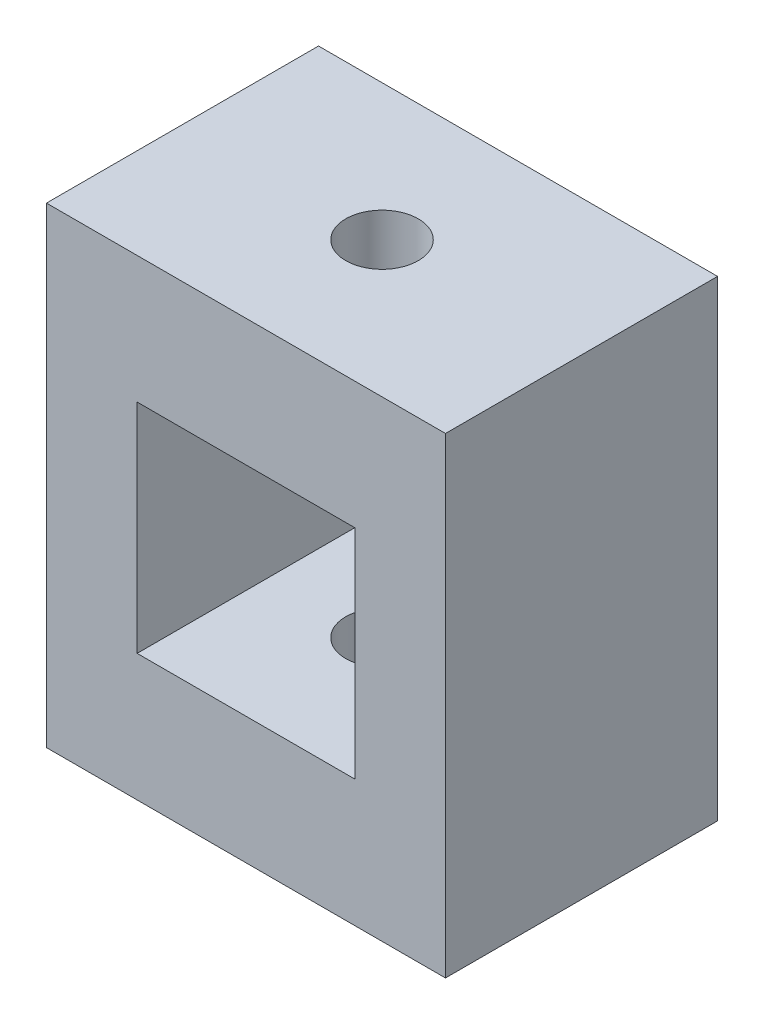
ISO-10303-21;
HEADER;
FILE_DESCRIPTION(('STEP AP214'),'2;1');
FILE_NAME('part.step','',(''),(''),'','','');
FILE_SCHEMA(('AUTOMOTIVE_DESIGN { 1 0 10303 214 1 1 1 1 }'));
ENDSEC;
DATA;
#1=APPLICATION_CONTEXT('core data for automotive mechanical design processes');
#2=APPLICATION_PROTOCOL_DEFINITION('international standard','automotive_design',2000,#1);
#3=PRODUCT_CONTEXT('',#1,'mechanical');
#4=PRODUCT('Part','Part','',(#3));
#5=PRODUCT_RELATED_PRODUCT_CATEGORY('part','',(#4));
#6=PRODUCT_DEFINITION_FORMATION('','',#4);
#7=PRODUCT_DEFINITION_CONTEXT('part definition',#1,'design');
#8=PRODUCT_DEFINITION('design','',#6,#7);
#9=PRODUCT_DEFINITION_SHAPE('','',#8);
#10=(LENGTH_UNIT() NAMED_UNIT(*) SI_UNIT(.MILLI.,.METRE.));
#11=(NAMED_UNIT(*) PLANE_ANGLE_UNIT() SI_UNIT($,.RADIAN.));
#12=(NAMED_UNIT(*) SI_UNIT($,.STERADIAN.) SOLID_ANGLE_UNIT());
#13=UNCERTAINTY_MEASURE_WITH_UNIT(LENGTH_MEASURE(1.E-05),#10,'distance_accuracy_value','');
#14=(GEOMETRIC_REPRESENTATION_CONTEXT(3) GLOBAL_UNCERTAINTY_ASSIGNED_CONTEXT((#13)) GLOBAL_UNIT_ASSIGNED_CONTEXT((#10,
#11,#12)) REPRESENTATION_CONTEXT('',''));
#15=CARTESIAN_POINT('',(0.,0.,0.));
#16=DIRECTION('',(0.,0.,1.));
#17=DIRECTION('',(1.,0.,0.));
#18=AXIS2_PLACEMENT_3D('',#15,#16,#17);
#19=CARTESIAN_POINT('',(0.,0.,15.));
#20=DIRECTION('',(0.,0.,-1.));
#21=DIRECTION('',(-1.,0.,0.));
#22=AXIS2_PLACEMENT_3D('',#19,#20,#21);
#23=PLANE('',#22);
#24=DIRECTION('',(0.,-1.,0.));
#25=VECTOR('',#24,1.);
#26=CARTESIAN_POINT('',(0.,0.,15.));
#27=LINE('',#26,#25);
#28=CARTESIAN_POINT('',(0.,26.,15.));
#29=VERTEX_POINT('',#28);
#30=CARTESIAN_POINT('',(0.,0.,15.));
#31=VERTEX_POINT('',#30);
#32=EDGE_CURVE('E162',#29,#31,#27,.T.);
#33=ORIENTED_EDGE('',*,*,#32,.T.);
#34=DIRECTION('',(1.,0.,0.));
#35=VECTOR('',#34,1.);
#36=CARTESIAN_POINT('',(0.,0.,15.));
#37=LINE('',#36,#35);
#38=CARTESIAN_POINT('',(22.,0.,15.));
#39=VERTEX_POINT('',#38);
#40=EDGE_CURVE('E166',#31,#39,#37,.T.);
#41=ORIENTED_EDGE('',*,*,#40,.T.);
#42=DIRECTION('',(0.,1.,0.));
#43=VECTOR('',#42,1.);
#44=CARTESIAN_POINT('',(22.,0.,15.));
#45=LINE('',#44,#43);
#46=CARTESIAN_POINT('',(22.,26.,15.));
#47=VERTEX_POINT('',#46);
#48=EDGE_CURVE('E170',#39,#47,#45,.T.);
#49=ORIENTED_EDGE('',*,*,#48,.T.);
#50=DIRECTION('',(-1.,0.,0.));
#51=VECTOR('',#50,1.);
#52=CARTESIAN_POINT('',(0.,26.,15.));
#53=LINE('',#52,#51);
#54=EDGE_CURVE('E173',#47,#29,#53,.T.);
#55=ORIENTED_EDGE('',*,*,#54,.T.);
#56=EDGE_LOOP('',(#33,#41,#49,#55));
#57=FACE_BOUND('',#56,.T.);
#58=DIRECTION('',(0.,-1.,0.));
#59=VECTOR('',#58,1.);
#60=CARTESIAN_POINT('',(4.99999999999999,7.,15.));
#61=LINE('',#60,#59);
#62=CARTESIAN_POINT('',(4.99999999999999,19.,15.));
#63=VERTEX_POINT('',#62);
#64=CARTESIAN_POINT('',(4.99999999999999,7.,15.));
#65=VERTEX_POINT('',#64);
#66=EDGE_CURVE('E112',#63,#65,#61,.T.);
#67=ORIENTED_EDGE('',*,*,#66,.F.);
#68=DIRECTION('',(-1.,0.,0.));
#69=VECTOR('',#68,1.);
#70=CARTESIAN_POINT('',(4.99999999999999,19.,15.));
#71=LINE('',#70,#69);
#72=CARTESIAN_POINT('',(17.,19.,15.));
#73=VERTEX_POINT('',#72);
#74=EDGE_CURVE('E138',#73,#63,#71,.T.);
#75=ORIENTED_EDGE('',*,*,#74,.F.);
#76=DIRECTION('',(0.,1.,0.));
#77=VECTOR('',#76,1.);
#78=CARTESIAN_POINT('',(17.,7.,15.));
#79=LINE('',#78,#77);
#80=CARTESIAN_POINT('',(17.,7.,15.));
#81=VERTEX_POINT('',#80);
#82=EDGE_CURVE('E134',#81,#73,#79,.T.);
#83=ORIENTED_EDGE('',*,*,#82,.F.);
#84=DIRECTION('',(1.,0.,0.));
#85=VECTOR('',#84,1.);
#86=CARTESIAN_POINT('',(4.99999999999999,7.,15.));
#87=LINE('',#86,#85);
#88=EDGE_CURVE('E121',#65,#81,#87,.T.);
#89=ORIENTED_EDGE('',*,*,#88,.F.);
#90=EDGE_LOOP('',(#67,#75,#83,#89));
#91=FACE_BOUND('',#90,.T.);
#92=ADVANCED_FACE('F45',(#57,#91),#23,.F.);
#93=CARTESIAN_POINT('',(0.,0.,0.));
#94=DIRECTION('',(0.,0.,-1.));
#95=DIRECTION('',(-1.,0.,0.));
#96=AXIS2_PLACEMENT_3D('',#93,#94,#95);
#97=PLANE('',#96);
#98=DIRECTION('',(0.,-1.,0.));
#99=VECTOR('',#98,1.);
#100=CARTESIAN_POINT('',(0.,0.,0.));
#101=LINE('',#100,#99);
#102=CARTESIAN_POINT('',(0.,26.,0.));
#103=VERTEX_POINT('',#102);
#104=CARTESIAN_POINT('',(0.,0.,0.));
#105=VERTEX_POINT('',#104);
#106=EDGE_CURVE('E130',#103,#105,#101,.T.);
#107=ORIENTED_EDGE('',*,*,#106,.F.);
#108=DIRECTION('',(-1.,0.,0.));
#109=VECTOR('',#108,1.);
#110=CARTESIAN_POINT('',(0.,26.,0.));
#111=LINE('',#110,#109);
#112=CARTESIAN_POINT('',(22.,26.,0.));
#113=VERTEX_POINT('',#112);
#114=EDGE_CURVE('E167',#113,#103,#111,.T.);
#115=ORIENTED_EDGE('',*,*,#114,.F.);
#116=DIRECTION('',(0.,1.,0.));
#117=VECTOR('',#116,1.);
#118=CARTESIAN_POINT('',(22.,0.,0.));
#119=LINE('',#118,#117);
#120=CARTESIAN_POINT('',(22.,0.,0.));
#121=VERTEX_POINT('',#120);
#122=EDGE_CURVE('E183',#121,#113,#119,.T.);
#123=ORIENTED_EDGE('',*,*,#122,.F.);
#124=DIRECTION('',(1.,0.,0.));
#125=VECTOR('',#124,1.);
#126=CARTESIAN_POINT('',(0.,0.,0.));
#127=LINE('',#126,#125);
#128=EDGE_CURVE('E180',#105,#121,#127,.T.);
#129=ORIENTED_EDGE('',*,*,#128,.F.);
#130=EDGE_LOOP('',(#107,#115,#123,#129));
#131=FACE_BOUND('',#130,.T.);
#132=DIRECTION('',(-1.,0.,0.));
#133=VECTOR('',#132,1.);
#134=CARTESIAN_POINT('',(4.99999999999999,19.,0.));
#135=LINE('',#134,#133);
#136=CARTESIAN_POINT('',(17.,19.,0.));
#137=VERTEX_POINT('',#136);
#138=CARTESIAN_POINT('',(4.99999999999999,19.,0.));
#139=VERTEX_POINT('',#138);
#140=EDGE_CURVE('E122',#137,#139,#135,.T.);
#141=ORIENTED_EDGE('',*,*,#140,.T.);
#142=DIRECTION('',(0.,-1.,0.));
#143=VECTOR('',#142,1.);
#144=CARTESIAN_POINT('',(4.99999999999999,7.,0.));
#145=LINE('',#144,#143);
#146=CARTESIAN_POINT('',(4.99999999999999,7.,0.));
#147=VERTEX_POINT('',#146);
#148=EDGE_CURVE('E70',#139,#147,#145,.T.);
#149=ORIENTED_EDGE('',*,*,#148,.T.);
#150=DIRECTION('',(1.,0.,0.));
#151=VECTOR('',#150,1.);
#152=CARTESIAN_POINT('',(4.99999999999999,7.,0.));
#153=LINE('',#152,#151);
#154=CARTESIAN_POINT('',(17.,7.,0.));
#155=VERTEX_POINT('',#154);
#156=EDGE_CURVE('E128',#147,#155,#153,.T.);
#157=ORIENTED_EDGE('',*,*,#156,.T.);
#158=DIRECTION('',(0.,1.,0.));
#159=VECTOR('',#158,1.);
#160=CARTESIAN_POINT('',(17.,7.,0.));
#161=LINE('',#160,#159);
#162=EDGE_CURVE('E149',#155,#137,#161,.T.);
#163=ORIENTED_EDGE('',*,*,#162,.T.);
#164=EDGE_LOOP('',(#141,#149,#157,#163));
#165=FACE_BOUND('',#164,.T.);
#166=ADVANCED_FACE('F207',(#131,#165),#97,.T.);
#167=CARTESIAN_POINT('',(0.,0.,15.));
#168=DIRECTION('',(1.,0.,0.));
#169=DIRECTION('',(0.,0.,-1.));
#170=AXIS2_PLACEMENT_3D('',#167,#168,#169);
#171=PLANE('',#170);
#172=ORIENTED_EDGE('',*,*,#106,.T.);
#173=DIRECTION('',(0.,0.,-1.));
#174=VECTOR('',#173,1.);
#175=CARTESIAN_POINT('',(0.,0.,15.));
#176=LINE('',#175,#174);
#177=EDGE_CURVE('E11',#31,#105,#176,.T.);
#178=ORIENTED_EDGE('',*,*,#177,.F.);
#179=ORIENTED_EDGE('',*,*,#32,.F.);
#180=DIRECTION('',(0.,0.,-1.));
#181=VECTOR('',#180,1.);
#182=CARTESIAN_POINT('',(0.,26.,15.));
#183=LINE('',#182,#181);
#184=EDGE_CURVE('E176',#29,#103,#183,.T.);
#185=ORIENTED_EDGE('',*,*,#184,.T.);
#186=EDGE_LOOP('',(#172,#178,#179,#185));
#187=FACE_BOUND('',#186,.T.);
#188=ADVANCED_FACE('F47',(#187),#171,.F.);
#189=CARTESIAN_POINT('',(0.,0.,15.));
#190=DIRECTION('',(0.,1.,0.));
#191=DIRECTION('',(0.,0.,1.));
#192=AXIS2_PLACEMENT_3D('',#189,#190,#191);
#193=PLANE('',#192);
#194=CARTESIAN_POINT('',(11.,0.,7.5));
#195=DIRECTION('',(0.,1.,0.));
#196=DIRECTION('',(0.,0.,1.));
#197=AXIS2_PLACEMENT_3D('',#194,#195,#196);
#198=CIRCLE('',#197,2.);
#199=CARTESIAN_POINT('',(11.,0.,9.5));
#200=VERTEX_POINT('',#199);
#201=EDGE_CURVE('E146',#200,#200,#198,.T.);
#202=ORIENTED_EDGE('',*,*,#201,.T.);
#203=EDGE_LOOP('',(#202));
#204=FACE_BOUND('',#203,.T.);
#205=ORIENTED_EDGE('',*,*,#128,.T.);
#206=DIRECTION('',(0.,0.,-1.));
#207=VECTOR('',#206,1.);
#208=CARTESIAN_POINT('',(22.,0.,15.));
#209=LINE('',#208,#207);
#210=EDGE_CURVE('E55',#39,#121,#209,.T.);
#211=ORIENTED_EDGE('',*,*,#210,.F.);
#212=ORIENTED_EDGE('',*,*,#40,.F.);
#213=ORIENTED_EDGE('',*,*,#177,.T.);
#214=EDGE_LOOP('',(#205,#211,#212,#213));
#215=FACE_BOUND('',#214,.T.);
#216=ADVANCED_FACE('F217',(#204,#215),#193,.F.);
#217=CARTESIAN_POINT('',(22.,0.,15.));
#218=DIRECTION('',(-1.,0.,0.));
#219=DIRECTION('',(0.,0.,1.));
#220=AXIS2_PLACEMENT_3D('',#217,#218,#219);
#221=PLANE('',#220);
#222=ORIENTED_EDGE('',*,*,#122,.T.);
#223=DIRECTION('',(0.,0.,-1.));
#224=VECTOR('',#223,1.);
#225=CARTESIAN_POINT('',(22.,26.,15.));
#226=LINE('',#225,#224);
#227=EDGE_CURVE('E191',#47,#113,#226,.T.);
#228=ORIENTED_EDGE('',*,*,#227,.F.);
#229=ORIENTED_EDGE('',*,*,#48,.F.);
#230=ORIENTED_EDGE('',*,*,#210,.T.);
#231=EDGE_LOOP('',(#222,#228,#229,#230));
#232=FACE_BOUND('',#231,.T.);
#233=ADVANCED_FACE('F201',(#232),#221,.F.);
#234=CARTESIAN_POINT('',(0.,26.,15.));
#235=DIRECTION('',(0.,-1.,0.));
#236=DIRECTION('',(0.,0.,-1.));
#237=AXIS2_PLACEMENT_3D('',#234,#235,#236);
#238=PLANE('',#237);
#239=CARTESIAN_POINT('',(11.,26.,7.5));
#240=DIRECTION('',(0.,1.,0.));
#241=DIRECTION('',(0.,0.,1.));
#242=AXIS2_PLACEMENT_3D('',#239,#240,#241);
#243=CIRCLE('',#242,2.);
#244=CARTESIAN_POINT('',(11.,26.,9.5));
#245=VERTEX_POINT('',#244);
#246=EDGE_CURVE('E244',#245,#245,#243,.T.);
#247=ORIENTED_EDGE('',*,*,#246,.F.);
#248=EDGE_LOOP('',(#247));
#249=FACE_BOUND('',#248,.T.);
#250=ORIENTED_EDGE('',*,*,#114,.T.);
#251=ORIENTED_EDGE('',*,*,#184,.F.);
#252=ORIENTED_EDGE('',*,*,#54,.F.);
#253=ORIENTED_EDGE('',*,*,#227,.T.);
#254=EDGE_LOOP('',(#250,#251,#252,#253));
#255=FACE_BOUND('',#254,.T.);
#256=ADVANCED_FACE('F211',(#249,#255),#238,.F.);
#257=CARTESIAN_POINT('',(4.99999999999999,7.,15.));
#258=DIRECTION('',(1.,0.,0.));
#259=DIRECTION('',(0.,0.,-1.));
#260=AXIS2_PLACEMENT_3D('',#257,#258,#259);
#261=PLANE('',#260);
#262=ORIENTED_EDGE('',*,*,#148,.F.);
#263=DIRECTION('',(0.,0.,-1.));
#264=VECTOR('',#263,1.);
#265=CARTESIAN_POINT('',(4.99999999999999,19.,15.));
#266=LINE('',#265,#264);
#267=EDGE_CURVE('E116',#63,#139,#266,.T.);
#268=ORIENTED_EDGE('',*,*,#267,.F.);
#269=ORIENTED_EDGE('',*,*,#66,.T.);
#270=DIRECTION('',(0.,0.,-1.));
#271=VECTOR('',#270,1.);
#272=CARTESIAN_POINT('',(4.99999999999999,7.,15.));
#273=LINE('',#272,#271);
#274=EDGE_CURVE('E115',#65,#147,#273,.T.);
#275=ORIENTED_EDGE('',*,*,#274,.T.);
#276=EDGE_LOOP('',(#262,#268,#269,#275));
#277=FACE_BOUND('',#276,.T.);
#278=ADVANCED_FACE('F114',(#277),#261,.T.);
#279=CARTESIAN_POINT('',(4.99999999999999,7.,15.));
#280=DIRECTION('',(0.,1.,0.));
#281=DIRECTION('',(-1.,0.,0.));
#282=AXIS2_PLACEMENT_3D('',#279,#280,#281);
#283=PLANE('',#282);
#284=CARTESIAN_POINT('',(11.,7.,7.5));
#285=DIRECTION('',(0.,1.,0.));
#286=DIRECTION('',(-1.,0.,0.));
#287=AXIS2_PLACEMENT_3D('',#284,#285,#286);
#288=CIRCLE('',#287,2.);
#289=CARTESIAN_POINT('',(9.,7.,7.5));
#290=VERTEX_POINT('',#289);
#291=EDGE_CURVE('E250',#290,#290,#288,.T.);
#292=ORIENTED_EDGE('',*,*,#291,.F.);
#293=EDGE_LOOP('',(#292));
#294=FACE_BOUND('',#293,.T.);
#295=ORIENTED_EDGE('',*,*,#156,.F.);
#296=ORIENTED_EDGE('',*,*,#274,.F.);
#297=ORIENTED_EDGE('',*,*,#88,.T.);
#298=DIRECTION('',(0.,0.,-1.));
#299=VECTOR('',#298,1.);
#300=CARTESIAN_POINT('',(17.,7.,15.));
#301=LINE('',#300,#299);
#302=EDGE_CURVE('E131',#81,#155,#301,.T.);
#303=ORIENTED_EDGE('',*,*,#302,.T.);
#304=EDGE_LOOP('',(#295,#296,#297,#303));
#305=FACE_BOUND('',#304,.T.);
#306=ADVANCED_FACE('F125',(#294,#305),#283,.T.);
#307=CARTESIAN_POINT('',(17.,7.,15.));
#308=DIRECTION('',(-1.,0.,0.));
#309=DIRECTION('',(0.,0.,1.));
#310=AXIS2_PLACEMENT_3D('',#307,#308,#309);
#311=PLANE('',#310);
#312=ORIENTED_EDGE('',*,*,#162,.F.);
#313=ORIENTED_EDGE('',*,*,#302,.F.);
#314=ORIENTED_EDGE('',*,*,#82,.T.);
#315=DIRECTION('',(0.,0.,-1.));
#316=VECTOR('',#315,1.);
#317=CARTESIAN_POINT('',(17.,19.,15.));
#318=LINE('',#317,#316);
#319=EDGE_CURVE('E62',#73,#137,#318,.T.);
#320=ORIENTED_EDGE('',*,*,#319,.T.);
#321=EDGE_LOOP('',(#312,#313,#314,#320));
#322=FACE_BOUND('',#321,.T.);
#323=ADVANCED_FACE('F270',(#322),#311,.T.);
#324=CARTESIAN_POINT('',(4.99999999999999,19.,15.));
#325=DIRECTION('',(0.,-1.,0.));
#326=DIRECTION('',(1.,0.,0.));
#327=AXIS2_PLACEMENT_3D('',#324,#325,#326);
#328=PLANE('',#327);
#329=CARTESIAN_POINT('',(11.,19.,7.5));
#330=DIRECTION('',(0.,-1.,0.));
#331=DIRECTION('',(1.,0.,0.));
#332=AXIS2_PLACEMENT_3D('',#329,#330,#331);
#333=CIRCLE('',#332,2.);
#334=CARTESIAN_POINT('',(13.,19.,7.5));
#335=VERTEX_POINT('',#334);
#336=EDGE_CURVE('E49',#335,#335,#333,.T.);
#337=ORIENTED_EDGE('',*,*,#336,.F.);
#338=EDGE_LOOP('',(#337));
#339=FACE_BOUND('',#338,.T.);
#340=ORIENTED_EDGE('',*,*,#140,.F.);
#341=ORIENTED_EDGE('',*,*,#319,.F.);
#342=ORIENTED_EDGE('',*,*,#74,.T.);
#343=ORIENTED_EDGE('',*,*,#267,.T.);
#344=EDGE_LOOP('',(#340,#341,#342,#343));
#345=FACE_BOUND('',#344,.T.);
#346=ADVANCED_FACE('F265',(#339,#345),#328,.T.);
#347=CARTESIAN_POINT('',(11.,-16.,7.5));
#348=DIRECTION('',(0.,1.,0.));
#349=DIRECTION('',(0.,0.,1.));
#350=AXIS2_PLACEMENT_3D('',#347,#348,#349);
#351=CYLINDRICAL_SURFACE('',#350,2.);
#352=ORIENTED_EDGE('',*,*,#336,.T.);
#353=EDGE_LOOP('',(#352));
#354=FACE_BOUND('',#353,.T.);
#355=ORIENTED_EDGE('',*,*,#246,.T.);
#356=EDGE_LOOP('',(#355));
#357=FACE_BOUND('',#356,.T.);
#358=ADVANCED_FACE('F259',(#354,#357),#351,.F.);
#359=ORIENTED_EDGE('',*,*,#291,.T.);
#360=EDGE_LOOP('',(#359));
#361=FACE_BOUND('',#360,.T.);
#362=ORIENTED_EDGE('',*,*,#201,.F.);
#363=EDGE_LOOP('',(#362));
#364=FACE_BOUND('',#363,.T.);
#365=ADVANCED_FACE('F257',(#361,#364),#351,.F.);
#366=CLOSED_SHELL('',(#92,#166,#188,#216,#233,#256,#278,#306,#323,#346,#358,#365));
#367=MANIFOLD_SOLID_BREP('B2',#366);
#368=ADVANCED_BREP_SHAPE_REPRESENTATION('',(#18,#367),#14);
#369=SHAPE_DEFINITION_REPRESENTATION(#9,#368);
ENDSEC;
END-ISO-10303-21;
